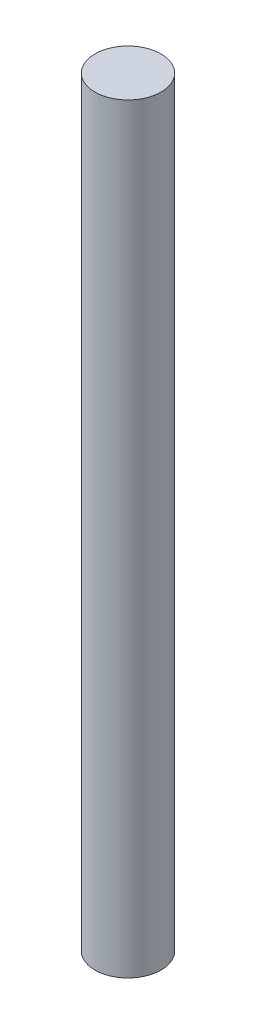
ISO-10303-21;
HEADER;
FILE_DESCRIPTION(('STEP AP214'),'2;1');
FILE_NAME('part.step','',(''),(''),'','','');
FILE_SCHEMA(('AUTOMOTIVE_DESIGN { 1 0 10303 214 1 1 1 1 }'));
ENDSEC;
DATA;
#1=APPLICATION_CONTEXT('core data for automotive mechanical design processes');
#2=APPLICATION_PROTOCOL_DEFINITION('international standard','automotive_design',2000,#1);
#3=PRODUCT_CONTEXT('',#1,'mechanical');
#4=PRODUCT('Part','Part','',(#3));
#5=PRODUCT_RELATED_PRODUCT_CATEGORY('part','',(#4));
#6=PRODUCT_DEFINITION_FORMATION('','',#4);
#7=PRODUCT_DEFINITION_CONTEXT('part definition',#1,'design');
#8=PRODUCT_DEFINITION('design','',#6,#7);
#9=PRODUCT_DEFINITION_SHAPE('','',#8);
#10=(LENGTH_UNIT() NAMED_UNIT(*) SI_UNIT(.MILLI.,.METRE.));
#11=(NAMED_UNIT(*) PLANE_ANGLE_UNIT() SI_UNIT($,.RADIAN.));
#12=(NAMED_UNIT(*) SI_UNIT($,.STERADIAN.) SOLID_ANGLE_UNIT());
#13=UNCERTAINTY_MEASURE_WITH_UNIT(LENGTH_MEASURE(1.E-05),#10,'distance_accuracy_value','');
#14=(GEOMETRIC_REPRESENTATION_CONTEXT(3) GLOBAL_UNCERTAINTY_ASSIGNED_CONTEXT((#13)) GLOBAL_UNIT_ASSIGNED_CONTEXT((#10,
#11,#12)) REPRESENTATION_CONTEXT('',''));
#15=CARTESIAN_POINT('',(0.,0.,0.));
#16=DIRECTION('',(0.,0.,1.));
#17=DIRECTION('',(1.,0.,0.));
#18=AXIS2_PLACEMENT_3D('',#15,#16,#17);
#19=CARTESIAN_POINT('',(0.,115.,0.));
#20=DIRECTION('',(0.,-1.,0.));
#21=DIRECTION('',(0.,0.,-1.));
#22=AXIS2_PLACEMENT_3D('',#19,#20,#21);
#23=CYLINDRICAL_SURFACE('',#22,5.);
#24=CARTESIAN_POINT('',(0.,115.,0.));
#25=DIRECTION('',(0.,1.,0.));
#26=DIRECTION('',(0.,0.,1.));
#27=AXIS2_PLACEMENT_3D('',#24,#25,#26);
#28=CIRCLE('',#27,5.);
#29=CARTESIAN_POINT('',(0.,115.,5.));
#30=VERTEX_POINT('',#29);
#31=EDGE_CURVE('E10',#30,#30,#28,.T.);
#32=ORIENTED_EDGE('',*,*,#31,.F.);
#33=EDGE_LOOP('',(#32));
#34=FACE_BOUND('',#33,.T.);
#35=CARTESIAN_POINT('',(0.,0.,0.));
#36=DIRECTION('',(0.,1.,0.));
#37=DIRECTION('',(0.,0.,1.));
#38=AXIS2_PLACEMENT_3D('',#35,#36,#37);
#39=CIRCLE('',#38,5.);
#40=CARTESIAN_POINT('',(0.,0.,5.));
#41=VERTEX_POINT('',#40);
#42=EDGE_CURVE('E34',#41,#41,#39,.T.);
#43=ORIENTED_EDGE('',*,*,#42,.T.);
#44=EDGE_LOOP('',(#43));
#45=FACE_BOUND('',#44,.T.);
#46=ADVANCED_FACE('F31',(#34,#45),#23,.T.);
#47=CARTESIAN_POINT('',(0.,115.,0.));
#48=DIRECTION('',(0.,1.,0.));
#49=DIRECTION('',(0.,0.,1.));
#50=AXIS2_PLACEMENT_3D('',#47,#48,#49);
#51=PLANE('',#50);
#52=ORIENTED_EDGE('',*,*,#31,.T.);
#53=EDGE_LOOP('',(#52));
#54=FACE_BOUND('',#53,.T.);
#55=ADVANCED_FACE('F46',(#54),#51,.T.);
#56=CARTESIAN_POINT('',(0.,0.,0.));
#57=DIRECTION('',(0.,1.,0.));
#58=DIRECTION('',(0.,0.,1.));
#59=AXIS2_PLACEMENT_3D('',#56,#57,#58);
#60=PLANE('',#59);
#61=ORIENTED_EDGE('',*,*,#42,.F.);
#62=EDGE_LOOP('',(#61));
#63=FACE_BOUND('',#62,.T.);
#64=ADVANCED_FACE('F44',(#63),#60,.F.);
#65=CLOSED_SHELL('',(#46,#55,#64));
#66=MANIFOLD_SOLID_BREP('B2',#65);
#67=ADVANCED_BREP_SHAPE_REPRESENTATION('',(#18,#66),#14);
#68=SHAPE_DEFINITION_REPRESENTATION(#9,#67);
ENDSEC;
END-ISO-10303-21;
